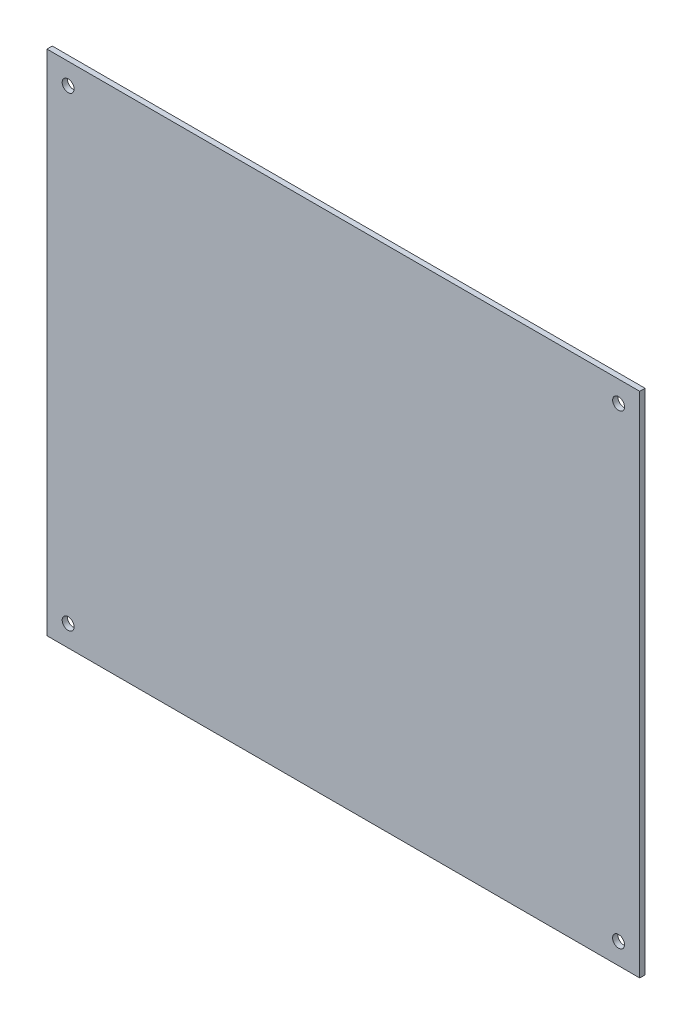
ISO-10303-21;
HEADER;
FILE_DESCRIPTION(('STEP AP214'),'2;1');
FILE_NAME('part.step','',(''),(''),'','','');
FILE_SCHEMA(('AUTOMOTIVE_DESIGN { 1 0 10303 214 1 1 1 1 }'));
ENDSEC;
DATA;
#1=APPLICATION_CONTEXT('core data for automotive mechanical design processes');
#2=APPLICATION_PROTOCOL_DEFINITION('international standard','automotive_design',2000,#1);
#3=PRODUCT_CONTEXT('',#1,'mechanical');
#4=PRODUCT('Part','Part','',(#3));
#5=PRODUCT_RELATED_PRODUCT_CATEGORY('part','',(#4));
#6=PRODUCT_DEFINITION_FORMATION('','',#4);
#7=PRODUCT_DEFINITION_CONTEXT('part definition',#1,'design');
#8=PRODUCT_DEFINITION('design','',#6,#7);
#9=PRODUCT_DEFINITION_SHAPE('','',#8);
#10=(LENGTH_UNIT() NAMED_UNIT(*) SI_UNIT(.MILLI.,.METRE.));
#11=(NAMED_UNIT(*) PLANE_ANGLE_UNIT() SI_UNIT($,.RADIAN.));
#12=(NAMED_UNIT(*) SI_UNIT($,.STERADIAN.) SOLID_ANGLE_UNIT());
#13=UNCERTAINTY_MEASURE_WITH_UNIT(LENGTH_MEASURE(1.E-05),#10,'distance_accuracy_value','');
#14=(GEOMETRIC_REPRESENTATION_CONTEXT(3) GLOBAL_UNCERTAINTY_ASSIGNED_CONTEXT((#13)) GLOBAL_UNIT_ASSIGNED_CONTEXT((#10,
#11,#12)) REPRESENTATION_CONTEXT('',''));
#15=CARTESIAN_POINT('',(0.,0.,0.));
#16=DIRECTION('',(0.,0.,1.));
#17=DIRECTION('',(1.,0.,0.));
#18=AXIS2_PLACEMENT_3D('',#15,#16,#17);
#19=CARTESIAN_POINT('',(0.,0.,3.175));
#20=DIRECTION('',(1.,0.,0.));
#21=DIRECTION('',(0.,1.,0.));
#22=AXIS2_PLACEMENT_3D('',#19,#20,#21);
#23=PLANE('',#22);
#24=DIRECTION('',(0.,-1.,0.));
#25=VECTOR('',#24,1.);
#26=CARTESIAN_POINT('',(0.,0.,0.));
#27=LINE('',#26,#25);
#28=CARTESIAN_POINT('',(0.,0.,0.));
#29=VERTEX_POINT('',#28);
#30=CARTESIAN_POINT('',(0.,-304.8,0.));
#31=VERTEX_POINT('',#30);
#32=EDGE_CURVE('E129',#29,#31,#27,.T.);
#33=ORIENTED_EDGE('',*,*,#32,.T.);
#34=DIRECTION('',(0.,0.,-1.));
#35=VECTOR('',#34,1.);
#36=CARTESIAN_POINT('',(0.,-304.8,3.175));
#37=LINE('',#36,#35);
#38=CARTESIAN_POINT('',(0.,-304.8,3.175));
#39=VERTEX_POINT('',#38);
#40=EDGE_CURVE('E11',#39,#31,#37,.T.);
#41=ORIENTED_EDGE('',*,*,#40,.F.);
#42=DIRECTION('',(0.,-1.,0.));
#43=VECTOR('',#42,1.);
#44=CARTESIAN_POINT('',(0.,0.,3.175));
#45=LINE('',#44,#43);
#46=CARTESIAN_POINT('',(0.,0.,3.175));
#47=VERTEX_POINT('',#46);
#48=EDGE_CURVE('E111',#47,#39,#45,.T.);
#49=ORIENTED_EDGE('',*,*,#48,.F.);
#50=DIRECTION('',(0.,0.,-1.));
#51=VECTOR('',#50,1.);
#52=CARTESIAN_POINT('',(0.,0.,3.175));
#53=LINE('',#52,#51);
#54=EDGE_CURVE('E125',#47,#29,#53,.T.);
#55=ORIENTED_EDGE('',*,*,#54,.T.);
#56=EDGE_LOOP('',(#33,#41,#49,#55));
#57=FACE_BOUND('',#56,.T.);
#58=ADVANCED_FACE('F51',(#57),#23,.F.);
#59=CARTESIAN_POINT('',(0.,-304.8,3.175));
#60=DIRECTION('',(0.,1.,0.));
#61=DIRECTION('',(0.,0.,1.));
#62=AXIS2_PLACEMENT_3D('',#59,#60,#61);
#63=PLANE('',#62);
#64=DIRECTION('',(1.,0.,0.));
#65=VECTOR('',#64,1.);
#66=CARTESIAN_POINT('',(0.,-304.8,0.));
#67=LINE('',#66,#65);
#68=CARTESIAN_POINT('',(355.6,-304.8,0.));
#69=VERTEX_POINT('',#68);
#70=EDGE_CURVE('E116',#31,#69,#67,.T.);
#71=ORIENTED_EDGE('',*,*,#70,.T.);
#72=DIRECTION('',(0.,0.,-1.));
#73=VECTOR('',#72,1.);
#74=CARTESIAN_POINT('',(355.6,-304.8,3.175));
#75=LINE('',#74,#73);
#76=CARTESIAN_POINT('',(355.6,-304.8,3.175));
#77=VERTEX_POINT('',#76);
#78=EDGE_CURVE('E60',#77,#69,#75,.T.);
#79=ORIENTED_EDGE('',*,*,#78,.F.);
#80=DIRECTION('',(1.,0.,0.));
#81=VECTOR('',#80,1.);
#82=CARTESIAN_POINT('',(0.,-304.8,3.175));
#83=LINE('',#82,#81);
#84=EDGE_CURVE('E105',#39,#77,#83,.T.);
#85=ORIENTED_EDGE('',*,*,#84,.F.);
#86=ORIENTED_EDGE('',*,*,#40,.T.);
#87=EDGE_LOOP('',(#71,#79,#85,#86));
#88=FACE_BOUND('',#87,.T.);
#89=ADVANCED_FACE('F115',(#88),#63,.F.);
#90=CARTESIAN_POINT('',(355.6,0.,3.175));
#91=DIRECTION('',(-1.,0.,0.));
#92=DIRECTION('',(0.,-1.,0.));
#93=AXIS2_PLACEMENT_3D('',#90,#91,#92);
#94=PLANE('',#93);
#95=DIRECTION('',(0.,1.,0.));
#96=VECTOR('',#95,1.);
#97=CARTESIAN_POINT('',(355.6,0.,0.));
#98=LINE('',#97,#96);
#99=CARTESIAN_POINT('',(355.6,0.,0.));
#100=VERTEX_POINT('',#99);
#101=EDGE_CURVE('E92',#69,#100,#98,.T.);
#102=ORIENTED_EDGE('',*,*,#101,.T.);
#103=DIRECTION('',(0.,0.,-1.));
#104=VECTOR('',#103,1.);
#105=CARTESIAN_POINT('',(355.6,0.,3.175));
#106=LINE('',#105,#104);
#107=CARTESIAN_POINT('',(355.6,0.,3.175));
#108=VERTEX_POINT('',#107);
#109=EDGE_CURVE('E118',#108,#100,#106,.T.);
#110=ORIENTED_EDGE('',*,*,#109,.F.);
#111=DIRECTION('',(0.,1.,0.));
#112=VECTOR('',#111,1.);
#113=CARTESIAN_POINT('',(355.6,0.,3.175));
#114=LINE('',#113,#112);
#115=EDGE_CURVE('E109',#77,#108,#114,.T.);
#116=ORIENTED_EDGE('',*,*,#115,.F.);
#117=ORIENTED_EDGE('',*,*,#78,.T.);
#118=EDGE_LOOP('',(#102,#110,#116,#117));
#119=FACE_BOUND('',#118,.T.);
#120=ADVANCED_FACE('F119',(#119),#94,.F.);
#121=CARTESIAN_POINT('',(0.,0.,3.175));
#122=DIRECTION('',(0.,-1.,0.));
#123=DIRECTION('',(0.,0.,-1.));
#124=AXIS2_PLACEMENT_3D('',#121,#122,#123);
#125=PLANE('',#124);
#126=DIRECTION('',(-1.,0.,0.));
#127=VECTOR('',#126,1.);
#128=CARTESIAN_POINT('',(0.,0.,0.));
#129=LINE('',#128,#127);
#130=EDGE_CURVE('E98',#100,#29,#129,.T.);
#131=ORIENTED_EDGE('',*,*,#130,.T.);
#132=ORIENTED_EDGE('',*,*,#54,.F.);
#133=DIRECTION('',(-1.,0.,0.));
#134=VECTOR('',#133,1.);
#135=CARTESIAN_POINT('',(0.,0.,3.175));
#136=LINE('',#135,#134);
#137=EDGE_CURVE('E70',#108,#47,#136,.T.);
#138=ORIENTED_EDGE('',*,*,#137,.F.);
#139=ORIENTED_EDGE('',*,*,#109,.T.);
#140=EDGE_LOOP('',(#131,#132,#138,#139));
#141=FACE_BOUND('',#140,.T.);
#142=ADVANCED_FACE('F145',(#141),#125,.F.);
#143=CARTESIAN_POINT('',(0.,0.,3.175));
#144=DIRECTION('',(0.,0.,1.));
#145=DIRECTION('',(1.,0.,0.));
#146=AXIS2_PLACEMENT_3D('',#143,#144,#145);
#147=PLANE('',#146);
#148=CARTESIAN_POINT('',(12.7,-12.7000000000001,3.175));
#149=DIRECTION('',(0.,0.,1.));
#150=DIRECTION('',(1.,0.,0.));
#151=AXIS2_PLACEMENT_3D('',#148,#149,#150);
#152=CIRCLE('',#151,3.57123999999999);
#153=CARTESIAN_POINT('',(16.27124,-12.7000000000001,3.175));
#154=VERTEX_POINT('',#153);
#155=EDGE_CURVE('E181',#154,#154,#152,.T.);
#156=ORIENTED_EDGE('',*,*,#155,.F.);
#157=EDGE_LOOP('',(#156));
#158=FACE_BOUND('',#157,.T.);
#159=CARTESIAN_POINT('',(342.9,-12.7,3.175));
#160=DIRECTION('',(0.,0.,1.));
#161=DIRECTION('',(1.,0.,0.));
#162=AXIS2_PLACEMENT_3D('',#159,#160,#161);
#163=CIRCLE('',#162,3.57123999999998);
#164=CARTESIAN_POINT('',(346.47124,-12.7,3.175));
#165=VERTEX_POINT('',#164);
#166=EDGE_CURVE('E173',#165,#165,#163,.T.);
#167=ORIENTED_EDGE('',*,*,#166,.F.);
#168=EDGE_LOOP('',(#167));
#169=FACE_BOUND('',#168,.T.);
#170=CARTESIAN_POINT('',(342.9,-292.1,3.175));
#171=DIRECTION('',(0.,0.,1.));
#172=DIRECTION('',(1.,0.,0.));
#173=AXIS2_PLACEMENT_3D('',#170,#171,#172);
#174=CIRCLE('',#173,3.57123999999998);
#175=CARTESIAN_POINT('',(346.47124,-292.1,3.175));
#176=VERTEX_POINT('',#175);
#177=EDGE_CURVE('E165',#176,#176,#174,.T.);
#178=ORIENTED_EDGE('',*,*,#177,.F.);
#179=EDGE_LOOP('',(#178));
#180=FACE_BOUND('',#179,.T.);
#181=CARTESIAN_POINT('',(12.6999999999999,-292.1,3.175));
#182=DIRECTION('',(0.,0.,1.));
#183=DIRECTION('',(1.,0.,0.));
#184=AXIS2_PLACEMENT_3D('',#181,#182,#183);
#185=CIRCLE('',#184,3.57123999999999);
#186=CARTESIAN_POINT('',(16.2712399999999,-292.1,3.175));
#187=VERTEX_POINT('',#186);
#188=EDGE_CURVE('E157',#187,#187,#185,.T.);
#189=ORIENTED_EDGE('',*,*,#188,.F.);
#190=EDGE_LOOP('',(#189));
#191=FACE_BOUND('',#190,.T.);
#192=ORIENTED_EDGE('',*,*,#48,.T.);
#193=ORIENTED_EDGE('',*,*,#84,.T.);
#194=ORIENTED_EDGE('',*,*,#115,.T.);
#195=ORIENTED_EDGE('',*,*,#137,.T.);
#196=EDGE_LOOP('',(#192,#193,#194,#195));
#197=FACE_BOUND('',#196,.T.);
#198=ADVANCED_FACE('F107',(#158,#169,#180,#191,#197),#147,.T.);
#199=CARTESIAN_POINT('',(0.,0.,0.));
#200=DIRECTION('',(0.,0.,1.));
#201=DIRECTION('',(1.,0.,0.));
#202=AXIS2_PLACEMENT_3D('',#199,#200,#201);
#203=PLANE('',#202);
#204=CARTESIAN_POINT('',(12.7,-12.7000000000001,0.));
#205=DIRECTION('',(0.,0.,1.));
#206=DIRECTION('',(1.,0.,0.));
#207=AXIS2_PLACEMENT_3D('',#204,#205,#206);
#208=CIRCLE('',#207,3.57123999999999);
#209=CARTESIAN_POINT('',(16.27124,-12.7000000000001,0.));
#210=VERTEX_POINT('',#209);
#211=EDGE_CURVE('E177',#210,#210,#208,.T.);
#212=ORIENTED_EDGE('',*,*,#211,.T.);
#213=EDGE_LOOP('',(#212));
#214=FACE_BOUND('',#213,.T.);
#215=CARTESIAN_POINT('',(342.9,-12.7,0.));
#216=DIRECTION('',(0.,0.,1.));
#217=DIRECTION('',(1.,0.,0.));
#218=AXIS2_PLACEMENT_3D('',#215,#216,#217);
#219=CIRCLE('',#218,3.57123999999998);
#220=CARTESIAN_POINT('',(346.47124,-12.7,0.));
#221=VERTEX_POINT('',#220);
#222=EDGE_CURVE('E169',#221,#221,#219,.T.);
#223=ORIENTED_EDGE('',*,*,#222,.T.);
#224=EDGE_LOOP('',(#223));
#225=FACE_BOUND('',#224,.T.);
#226=CARTESIAN_POINT('',(342.9,-292.1,0.));
#227=DIRECTION('',(0.,0.,1.));
#228=DIRECTION('',(1.,0.,0.));
#229=AXIS2_PLACEMENT_3D('',#226,#227,#228);
#230=CIRCLE('',#229,3.57123999999998);
#231=CARTESIAN_POINT('',(346.47124,-292.1,0.));
#232=VERTEX_POINT('',#231);
#233=EDGE_CURVE('E161',#232,#232,#230,.T.);
#234=ORIENTED_EDGE('',*,*,#233,.T.);
#235=EDGE_LOOP('',(#234));
#236=FACE_BOUND('',#235,.T.);
#237=CARTESIAN_POINT('',(12.6999999999999,-292.1,0.));
#238=DIRECTION('',(0.,0.,1.));
#239=DIRECTION('',(1.,0.,0.));
#240=AXIS2_PLACEMENT_3D('',#237,#238,#239);
#241=CIRCLE('',#240,3.57123999999999);
#242=CARTESIAN_POINT('',(16.2712399999999,-292.1,0.));
#243=VERTEX_POINT('',#242);
#244=EDGE_CURVE('E133',#243,#243,#241,.T.);
#245=ORIENTED_EDGE('',*,*,#244,.T.);
#246=EDGE_LOOP('',(#245));
#247=FACE_BOUND('',#246,.T.);
#248=ORIENTED_EDGE('',*,*,#32,.F.);
#249=ORIENTED_EDGE('',*,*,#130,.F.);
#250=ORIENTED_EDGE('',*,*,#101,.F.);
#251=ORIENTED_EDGE('',*,*,#70,.F.);
#252=EDGE_LOOP('',(#248,#249,#250,#251));
#253=FACE_BOUND('',#252,.T.);
#254=ADVANCED_FACE('F148',(#214,#225,#236,#247,#253),#203,.F.);
#255=CARTESIAN_POINT('',(12.6999999999999,-292.1,3.175));
#256=DIRECTION('',(0.,0.,1.));
#257=DIRECTION('',(1.,0.,0.));
#258=AXIS2_PLACEMENT_3D('',#255,#256,#257);
#259=CYLINDRICAL_SURFACE('',#258,3.57123999999999);
#260=ORIENTED_EDGE('',*,*,#244,.F.);
#261=EDGE_LOOP('',(#260));
#262=FACE_BOUND('',#261,.T.);
#263=ORIENTED_EDGE('',*,*,#188,.T.);
#264=EDGE_LOOP('',(#263));
#265=FACE_BOUND('',#264,.T.);
#266=ADVANCED_FACE('F199',(#262,#265),#259,.F.);
#267=CARTESIAN_POINT('',(342.9,-292.1,3.175));
#268=DIRECTION('',(0.,0.,1.));
#269=DIRECTION('',(1.,0.,0.));
#270=AXIS2_PLACEMENT_3D('',#267,#268,#269);
#271=CYLINDRICAL_SURFACE('',#270,3.57123999999998);
#272=ORIENTED_EDGE('',*,*,#233,.F.);
#273=EDGE_LOOP('',(#272));
#274=FACE_BOUND('',#273,.T.);
#275=ORIENTED_EDGE('',*,*,#177,.T.);
#276=EDGE_LOOP('',(#275));
#277=FACE_BOUND('',#276,.T.);
#278=ADVANCED_FACE('F201',(#274,#277),#271,.F.);
#279=CARTESIAN_POINT('',(342.9,-12.7,3.175));
#280=DIRECTION('',(0.,0.,1.));
#281=DIRECTION('',(1.,0.,0.));
#282=AXIS2_PLACEMENT_3D('',#279,#280,#281);
#283=CYLINDRICAL_SURFACE('',#282,3.57123999999998);
#284=ORIENTED_EDGE('',*,*,#222,.F.);
#285=EDGE_LOOP('',(#284));
#286=FACE_BOUND('',#285,.T.);
#287=ORIENTED_EDGE('',*,*,#166,.T.);
#288=EDGE_LOOP('',(#287));
#289=FACE_BOUND('',#288,.T.);
#290=ADVANCED_FACE('F208',(#286,#289),#283,.F.);
#291=CARTESIAN_POINT('',(12.7,-12.7000000000001,3.175));
#292=DIRECTION('',(0.,0.,1.));
#293=DIRECTION('',(1.,0.,0.));
#294=AXIS2_PLACEMENT_3D('',#291,#292,#293);
#295=CYLINDRICAL_SURFACE('',#294,3.57123999999999);
#296=ORIENTED_EDGE('',*,*,#211,.F.);
#297=EDGE_LOOP('',(#296));
#298=FACE_BOUND('',#297,.T.);
#299=ORIENTED_EDGE('',*,*,#155,.T.);
#300=EDGE_LOOP('',(#299));
#301=FACE_BOUND('',#300,.T.);
#302=ADVANCED_FACE('F188',(#298,#301),#295,.F.);
#303=CLOSED_SHELL('',(#58,#89,#120,#142,#198,#254,#266,#278,#290,#302));
#304=MANIFOLD_SOLID_BREP('B2',#303);
#305=ADVANCED_BREP_SHAPE_REPRESENTATION('',(#18,#304),#14);
#306=SHAPE_DEFINITION_REPRESENTATION(#9,#305);
ENDSEC;
END-ISO-10303-21;
